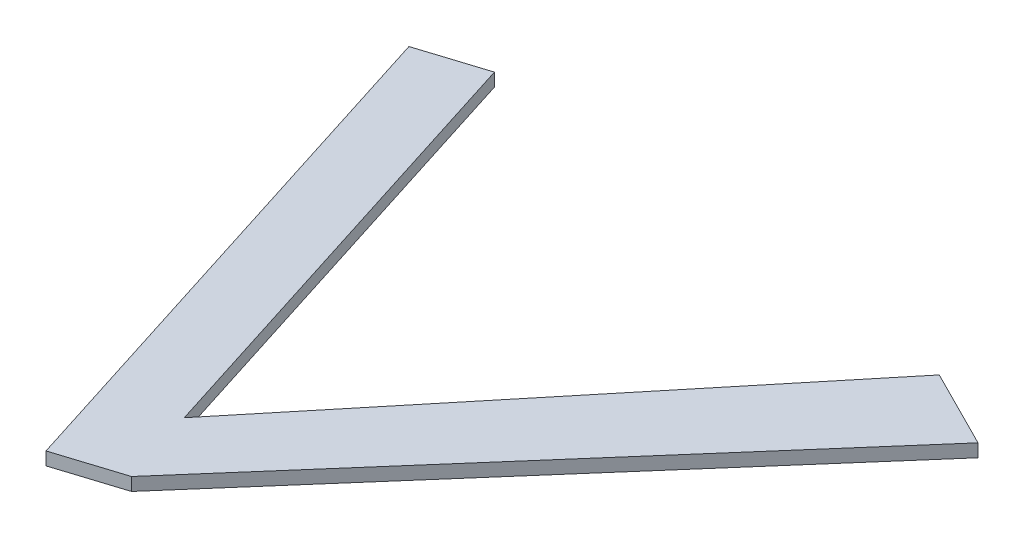
ISO-10303-21;
HEADER;
FILE_DESCRIPTION(('STEP AP214'),'2;1');
FILE_NAME('part.step','',(''),(''),'','','');
FILE_SCHEMA(('AUTOMOTIVE_DESIGN { 1 0 10303 214 1 1 1 1 }'));
ENDSEC;
DATA;
#1=APPLICATION_CONTEXT('core data for automotive mechanical design processes');
#2=APPLICATION_PROTOCOL_DEFINITION('international standard','automotive_design',2000,#1);
#3=PRODUCT_CONTEXT('',#1,'mechanical');
#4=PRODUCT('Part','Part','',(#3));
#5=PRODUCT_RELATED_PRODUCT_CATEGORY('part','',(#4));
#6=PRODUCT_DEFINITION_FORMATION('','',#4);
#7=PRODUCT_DEFINITION_CONTEXT('part definition',#1,'design');
#8=PRODUCT_DEFINITION('design','',#6,#7);
#9=PRODUCT_DEFINITION_SHAPE('','',#8);
#10=(LENGTH_UNIT() NAMED_UNIT(*) SI_UNIT(.MILLI.,.METRE.));
#11=(NAMED_UNIT(*) PLANE_ANGLE_UNIT() SI_UNIT($,.RADIAN.));
#12=(NAMED_UNIT(*) SI_UNIT($,.STERADIAN.) SOLID_ANGLE_UNIT());
#13=UNCERTAINTY_MEASURE_WITH_UNIT(LENGTH_MEASURE(1.E-05),#10,'distance_accuracy_value','');
#14=(GEOMETRIC_REPRESENTATION_CONTEXT(3) GLOBAL_UNCERTAINTY_ASSIGNED_CONTEXT((#13)) GLOBAL_UNIT_ASSIGNED_CONTEXT((#10,
#11,#12)) REPRESENTATION_CONTEXT('',''));
#15=CARTESIAN_POINT('',(0.,0.,0.));
#16=DIRECTION('',(0.,0.,1.));
#17=DIRECTION('',(1.,0.,0.));
#18=AXIS2_PLACEMENT_3D('',#15,#16,#17);
#19=CARTESIAN_POINT('',(26.2413251056622,1.,-31.9564603280611));
#20=DIRECTION('',(0.772828544814053,0.,0.63461487559038));
#21=DIRECTION('',(0.63461487559038,0.,-0.772828544814053));
#22=AXIS2_PLACEMENT_3D('',#19,#20,#21);
#23=PLANE('',#22);
#24=DIRECTION('',(-0.63461487559038,0.,0.772828544814053));
#25=VECTOR('',#24,1.);
#26=CARTESIAN_POINT('',(26.2413251056622,0.,-31.9564603280611));
#27=LINE('',#26,#25);
#28=CARTESIAN_POINT('',(26.2413251056622,0.,-31.9564603280611));
#29=VERTEX_POINT('',#28);
#30=CARTESIAN_POINT('',(0.,0.,0.));
#31=VERTEX_POINT('',#30);
#32=EDGE_CURVE('E134',#29,#31,#27,.T.);
#33=ORIENTED_EDGE('',*,*,#32,.T.);
#34=DIRECTION('',(0.,-1.,0.));
#35=VECTOR('',#34,1.);
#36=CARTESIAN_POINT('',(0.,1.,0.));
#37=LINE('',#36,#35);
#38=CARTESIAN_POINT('',(0.,1.,0.));
#39=VERTEX_POINT('',#38);
#40=EDGE_CURVE('E11',#39,#31,#37,.T.);
#41=ORIENTED_EDGE('',*,*,#40,.F.);
#42=DIRECTION('',(-0.63461487559038,0.,0.772828544814053));
#43=VECTOR('',#42,1.);
#44=CARTESIAN_POINT('',(26.2413251056622,1.,-31.9564603280611));
#45=LINE('',#44,#43);
#46=CARTESIAN_POINT('',(26.2413251056622,1.,-31.9564603280611));
#47=VERTEX_POINT('',#46);
#48=EDGE_CURVE('E153',#47,#39,#45,.T.);
#49=ORIENTED_EDGE('',*,*,#48,.F.);
#50=DIRECTION('',(0.,-1.,0.));
#51=VECTOR('',#50,1.);
#52=CARTESIAN_POINT('',(26.2413251056622,1.,-31.9564603280611));
#53=LINE('',#52,#51);
#54=EDGE_CURVE('E130',#47,#29,#53,.T.);
#55=ORIENTED_EDGE('',*,*,#54,.T.);
#56=EDGE_LOOP('',(#33,#41,#49,#55));
#57=FACE_BOUND('',#56,.T.);
#58=ADVANCED_FACE('F39',(#57),#23,.F.);
#59=CARTESIAN_POINT('',(0.,1.,0.));
#60=DIRECTION('',(-0.953145411017594,0.,0.302512521155906));
#61=DIRECTION('',(0.302512521155906,0.,0.953145411017594));
#62=AXIS2_PLACEMENT_3D('',#59,#60,#61);
#63=PLANE('',#62);
#64=DIRECTION('',(-0.302512521155906,0.,-0.953145411017593));
#65=VECTOR('',#64,1.);
#66=CARTESIAN_POINT('',(0.,0.,0.));
#67=LINE('',#66,#65);
#68=CARTESIAN_POINT('',(-11.1173351524796,0.,-35.0280938548966));
#69=VERTEX_POINT('',#68);
#70=EDGE_CURVE('E138',#31,#69,#67,.T.);
#71=ORIENTED_EDGE('',*,*,#70,.T.);
#72=DIRECTION('',(0.,-1.,0.));
#73=VECTOR('',#72,1.);
#74=CARTESIAN_POINT('',(-11.1173351524796,1.,-35.0280938548966));
#75=LINE('',#74,#73);
#76=CARTESIAN_POINT('',(-11.1173351524796,1.,-35.0280938548966));
#77=VERTEX_POINT('',#76);
#78=EDGE_CURVE('E48',#77,#69,#75,.T.);
#79=ORIENTED_EDGE('',*,*,#78,.F.);
#80=DIRECTION('',(-0.302512521155906,0.,-0.953145411017593));
#81=VECTOR('',#80,1.);
#82=CARTESIAN_POINT('',(0.,1.,0.));
#83=LINE('',#82,#81);
#84=EDGE_CURVE('E96',#39,#77,#83,.T.);
#85=ORIENTED_EDGE('',*,*,#84,.F.);
#86=ORIENTED_EDGE('',*,*,#40,.T.);
#87=EDGE_LOOP('',(#71,#79,#85,#86));
#88=FACE_BOUND('',#87,.T.);
#89=ADVANCED_FACE('F187',(#88),#63,.F.);
#90=CARTESIAN_POINT('',(-11.1173351524796,1.,-35.0280938548966));
#91=DIRECTION('',(0.302512521155906,0.,0.953145411017594));
#92=DIRECTION('',(0.953145411017594,0.,-0.302512521155906));
#93=AXIS2_PLACEMENT_3D('',#90,#91,#92);
#94=PLANE('',#93);
#95=DIRECTION('',(-0.953145411017594,0.,0.302512521155906));
#96=VECTOR('',#95,1.);
#97=CARTESIAN_POINT('',(-11.1173351524796,0.,-35.0280938548966));
#98=LINE('',#97,#96);
#99=CARTESIAN_POINT('',(-16.1213485603219,0.,-33.4399031188281));
#100=VERTEX_POINT('',#99);
#101=EDGE_CURVE('E141',#69,#100,#98,.T.);
#102=ORIENTED_EDGE('',*,*,#101,.T.);
#103=DIRECTION('',(0.,-1.,0.));
#104=VECTOR('',#103,1.);
#105=CARTESIAN_POINT('',(-16.1213485603219,1.,-33.4399031188281));
#106=LINE('',#105,#104);
#107=CARTESIAN_POINT('',(-16.1213485603219,1.,-33.4399031188281));
#108=VERTEX_POINT('',#107);
#109=EDGE_CURVE('E160',#108,#100,#106,.T.);
#110=ORIENTED_EDGE('',*,*,#109,.F.);
#111=DIRECTION('',(-0.953145411017594,0.,0.302512521155906));
#112=VECTOR('',#111,1.);
#113=CARTESIAN_POINT('',(-11.1173351524796,1.,-35.0280938548966));
#114=LINE('',#113,#112);
#115=EDGE_CURVE('E170',#77,#108,#114,.T.);
#116=ORIENTED_EDGE('',*,*,#115,.F.);
#117=ORIENTED_EDGE('',*,*,#78,.T.);
#118=EDGE_LOOP('',(#102,#110,#116,#117));
#119=FACE_BOUND('',#118,.T.);
#120=ADVANCED_FACE('F168',(#119),#94,.F.);
#121=CARTESIAN_POINT('',(-16.1213485603219,1.,-33.4399031188281));
#122=DIRECTION('',(0.953145411017594,0.,-0.302512521155906));
#123=DIRECTION('',(-0.302512521155906,0.,-0.953145411017593));
#124=AXIS2_PLACEMENT_3D('',#121,#122,#123);
#125=PLANE('',#124);
#126=DIRECTION('',(0.302512521155906,0.,0.953145411017593));
#127=VECTOR('',#126,1.);
#128=CARTESIAN_POINT('',(-16.1213485603219,0.,-33.4399031188281));
#129=LINE('',#128,#127);
#130=CARTESIAN_POINT('',(-3.11331015061794,0.,7.54534955492846));
#131=VERTEX_POINT('',#130);
#132=EDGE_CURVE('E144',#100,#131,#129,.T.);
#133=ORIENTED_EDGE('',*,*,#132,.T.);
#134=DIRECTION('',(0.,-1.,0.));
#135=VECTOR('',#134,1.);
#136=CARTESIAN_POINT('',(-3.11331015061794,1.,7.54534955492846));
#137=LINE('',#136,#135);
#138=CARTESIAN_POINT('',(-3.11331015061794,1.,7.54534955492846));
#139=VERTEX_POINT('',#138);
#140=EDGE_CURVE('E123',#139,#131,#137,.T.);
#141=ORIENTED_EDGE('',*,*,#140,.F.);
#142=DIRECTION('',(0.302512521155906,0.,0.953145411017593));
#143=VECTOR('',#142,1.);
#144=CARTESIAN_POINT('',(-16.1213485603219,1.,-33.4399031188281));
#145=LINE('',#144,#143);
#146=EDGE_CURVE('E112',#108,#139,#145,.T.);
#147=ORIENTED_EDGE('',*,*,#146,.F.);
#148=ORIENTED_EDGE('',*,*,#109,.T.);
#149=EDGE_LOOP('',(#133,#141,#147,#148));
#150=FACE_BOUND('',#149,.T.);
#151=ADVANCED_FACE('F176',(#150),#125,.F.);
#152=CARTESIAN_POINT('',(-3.11331015061794,1.,7.54534955492846));
#153=DIRECTION('',(-0.302512521155907,0.,-0.953145411017594));
#154=DIRECTION('',(-0.953145411017594,0.,0.302512521155907));
#155=AXIS2_PLACEMENT_3D('',#152,#153,#154);
#156=PLANE('',#155);
#157=DIRECTION('',(0.953145411017593,0.,-0.302512521155907));
#158=VECTOR('',#157,1.);
#159=CARTESIAN_POINT('',(-3.11331015061794,0.,7.54534955492846));
#160=LINE('',#159,#158);
#161=CARTESIAN_POINT('',(1.89070325722442,0.,5.95715881885995));
#162=VERTEX_POINT('',#161);
#163=EDGE_CURVE('E121',#131,#162,#160,.T.);
#164=ORIENTED_EDGE('',*,*,#163,.T.);
#165=DIRECTION('',(0.,-1.,0.));
#166=VECTOR('',#165,1.);
#167=CARTESIAN_POINT('',(1.89070325722442,1.,5.95715881885995));
#168=LINE('',#167,#166);
#169=CARTESIAN_POINT('',(1.89070325722442,1.,5.95715881885995));
#170=VERTEX_POINT('',#169);
#171=EDGE_CURVE('E118',#170,#162,#168,.T.);
#172=ORIENTED_EDGE('',*,*,#171,.F.);
#173=DIRECTION('',(0.953145411017593,0.,-0.302512521155907));
#174=VECTOR('',#173,1.);
#175=CARTESIAN_POINT('',(-3.11331015061794,1.,7.54534955492846));
#176=LINE('',#175,#174);
#177=EDGE_CURVE('E106',#139,#170,#176,.T.);
#178=ORIENTED_EDGE('',*,*,#177,.F.);
#179=ORIENTED_EDGE('',*,*,#140,.T.);
#180=EDGE_LOOP('',(#164,#172,#178,#179));
#181=FACE_BOUND('',#180,.T.);
#182=ADVANCED_FACE('F119',(#181),#156,.F.);
#183=CARTESIAN_POINT('',(1.89070325722442,1.,5.95715881885995));
#184=DIRECTION('',(-0.754048444971918,0.,-0.656818805025734));
#185=DIRECTION('',(-0.656818805025734,0.,0.754048444971918));
#186=AXIS2_PLACEMENT_3D('',#183,#184,#185);
#187=PLANE('',#186);
#188=DIRECTION('',(0.656818805025734,0.,-0.754048444971918));
#189=VECTOR('',#188,1.);
#190=CARTESIAN_POINT('',(1.89070325722442,0.,5.95715881885995));
#191=LINE('',#190,#189);
#192=CARTESIAN_POINT('',(32.2685729896646,0.,-28.9175817610912));
#193=VERTEX_POINT('',#192);
#194=EDGE_CURVE('E82',#162,#193,#191,.T.);
#195=ORIENTED_EDGE('',*,*,#194,.T.);
#196=DIRECTION('',(0.,-1.,0.));
#197=VECTOR('',#196,1.);
#198=CARTESIAN_POINT('',(32.2685729896646,1.,-28.9175817610912));
#199=LINE('',#198,#197);
#200=CARTESIAN_POINT('',(32.2685729896646,1.,-28.9175817610912));
#201=VERTEX_POINT('',#200);
#202=EDGE_CURVE('E124',#201,#193,#199,.T.);
#203=ORIENTED_EDGE('',*,*,#202,.F.);
#204=DIRECTION('',(0.656818805025734,0.,-0.754048444971918));
#205=VECTOR('',#204,1.);
#206=CARTESIAN_POINT('',(1.89070325722442,1.,5.95715881885995));
#207=LINE('',#206,#205);
#208=EDGE_CURVE('E110',#170,#201,#207,.T.);
#209=ORIENTED_EDGE('',*,*,#208,.F.);
#210=ORIENTED_EDGE('',*,*,#171,.T.);
#211=EDGE_LOOP('',(#195,#203,#209,#210));
#212=FACE_BOUND('',#211,.T.);
#213=ADVANCED_FACE('F126',(#212),#187,.F.);
#214=CARTESIAN_POINT('',(32.2685729896646,1.,-28.9175817610912));
#215=DIRECTION('',(-0.45020423214368,0.,0.892925612444799));
#216=DIRECTION('',(0.892925612444799,0.,0.45020423214368));
#217=AXIS2_PLACEMENT_3D('',#214,#215,#216);
#218=PLANE('',#217);
#219=DIRECTION('',(-0.892925612444799,0.,-0.45020423214368));
#220=VECTOR('',#219,1.);
#221=CARTESIAN_POINT('',(32.2685729896646,0.,-28.9175817610912));
#222=LINE('',#221,#220);
#223=EDGE_CURVE('E88',#193,#29,#222,.T.);
#224=ORIENTED_EDGE('',*,*,#223,.T.);
#225=ORIENTED_EDGE('',*,*,#54,.F.);
#226=DIRECTION('',(-0.892925612444799,0.,-0.45020423214368));
#227=VECTOR('',#226,1.);
#228=CARTESIAN_POINT('',(32.2685729896646,1.,-28.9175817610912));
#229=LINE('',#228,#227);
#230=EDGE_CURVE('E56',#201,#47,#229,.T.);
#231=ORIENTED_EDGE('',*,*,#230,.F.);
#232=ORIENTED_EDGE('',*,*,#202,.T.);
#233=EDGE_LOOP('',(#224,#225,#231,#232));
#234=FACE_BOUND('',#233,.T.);
#235=ADVANCED_FACE('F201',(#234),#218,.F.);
#236=CARTESIAN_POINT('',(0.,1.,0.));
#237=DIRECTION('',(0.,-1.,0.));
#238=DIRECTION('',(0.,0.,-1.));
#239=AXIS2_PLACEMENT_3D('',#236,#237,#238);
#240=PLANE('',#239);
#241=ORIENTED_EDGE('',*,*,#48,.T.);
#242=ORIENTED_EDGE('',*,*,#84,.T.);
#243=ORIENTED_EDGE('',*,*,#115,.T.);
#244=ORIENTED_EDGE('',*,*,#146,.T.);
#245=ORIENTED_EDGE('',*,*,#177,.T.);
#246=ORIENTED_EDGE('',*,*,#208,.T.);
#247=ORIENTED_EDGE('',*,*,#230,.T.);
#248=EDGE_LOOP('',(#241,#242,#243,#244,#245,#246,#247));
#249=FACE_BOUND('',#248,.T.);
#250=ADVANCED_FACE('F108',(#249),#240,.F.);
#251=CARTESIAN_POINT('',(0.,0.,0.));
#252=DIRECTION('',(0.,-1.,0.));
#253=DIRECTION('',(0.,0.,-1.));
#254=AXIS2_PLACEMENT_3D('',#251,#252,#253);
#255=PLANE('',#254);
#256=ORIENTED_EDGE('',*,*,#32,.F.);
#257=ORIENTED_EDGE('',*,*,#223,.F.);
#258=ORIENTED_EDGE('',*,*,#194,.F.);
#259=ORIENTED_EDGE('',*,*,#163,.F.);
#260=ORIENTED_EDGE('',*,*,#132,.F.);
#261=ORIENTED_EDGE('',*,*,#101,.F.);
#262=ORIENTED_EDGE('',*,*,#70,.F.);
#263=EDGE_LOOP('',(#256,#257,#258,#259,#260,#261,#262));
#264=FACE_BOUND('',#263,.T.);
#265=ADVANCED_FACE('F174',(#264),#255,.T.);
#266=CLOSED_SHELL('',(#58,#89,#120,#151,#182,#213,#235,#250,#265));
#267=MANIFOLD_SOLID_BREP('B2',#266);
#268=ADVANCED_BREP_SHAPE_REPRESENTATION('',(#18,#267),#14);
#269=SHAPE_DEFINITION_REPRESENTATION(#9,#268);
ENDSEC;
END-ISO-10303-21;
